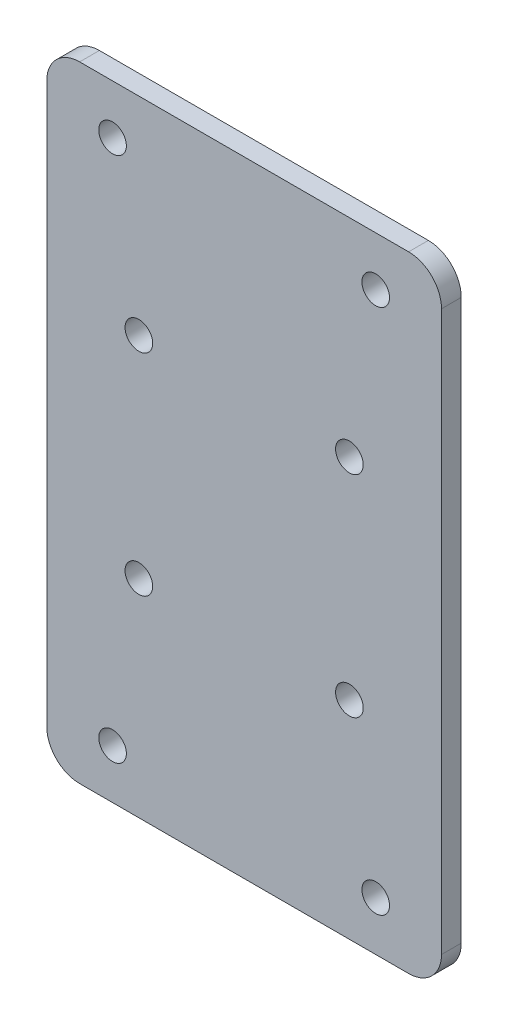
ISO-10303-21;
HEADER;
FILE_DESCRIPTION(('STEP AP214'),'2;1');
FILE_NAME('part.step','',(''),(''),'','','');
FILE_SCHEMA(('AUTOMOTIVE_DESIGN { 1 0 10303 214 1 1 1 1 }'));
ENDSEC;
DATA;
#1=APPLICATION_CONTEXT('core data for automotive mechanical design processes');
#2=APPLICATION_PROTOCOL_DEFINITION('international standard','automotive_design',2000,#1);
#3=PRODUCT_CONTEXT('',#1,'mechanical');
#4=PRODUCT('Part','Part','',(#3));
#5=PRODUCT_RELATED_PRODUCT_CATEGORY('part','',(#4));
#6=PRODUCT_DEFINITION_FORMATION('','',#4);
#7=PRODUCT_DEFINITION_CONTEXT('part definition',#1,'design');
#8=PRODUCT_DEFINITION('design','',#6,#7);
#9=PRODUCT_DEFINITION_SHAPE('','',#8);
#10=(LENGTH_UNIT() NAMED_UNIT(*) SI_UNIT(.MILLI.,.METRE.));
#11=(NAMED_UNIT(*) PLANE_ANGLE_UNIT() SI_UNIT($,.RADIAN.));
#12=(NAMED_UNIT(*) SI_UNIT($,.STERADIAN.) SOLID_ANGLE_UNIT());
#13=UNCERTAINTY_MEASURE_WITH_UNIT(LENGTH_MEASURE(1.E-05),#10,'distance_accuracy_value','');
#14=(GEOMETRIC_REPRESENTATION_CONTEXT(3) GLOBAL_UNCERTAINTY_ASSIGNED_CONTEXT((#13)) GLOBAL_UNIT_ASSIGNED_CONTEXT((#10,
#11,#12)) REPRESENTATION_CONTEXT('',''));
#15=CARTESIAN_POINT('',(0.,0.,0.));
#16=DIRECTION('',(0.,0.,1.));
#17=DIRECTION('',(1.,0.,0.));
#18=AXIS2_PLACEMENT_3D('',#15,#16,#17);
#19=CARTESIAN_POINT('',(0.,0.,3.));
#20=DIRECTION('',(0.,0.,1.));
#21=DIRECTION('',(1.,0.,0.));
#22=AXIS2_PLACEMENT_3D('',#19,#20,#21);
#23=PLANE('',#22);
#24=CARTESIAN_POINT('',(20.,40.,3.));
#25=DIRECTION('',(0.,0.,1.));
#26=DIRECTION('',(1.,0.,0.));
#27=AXIS2_PLACEMENT_3D('',#24,#25,#26);
#28=CIRCLE('',#27,2.1);
#29=CARTESIAN_POINT('',(22.1,40.,3.));
#30=VERTEX_POINT('',#29);
#31=EDGE_CURVE('E248',#30,#30,#28,.T.);
#32=ORIENTED_EDGE('',*,*,#31,.F.);
#33=EDGE_LOOP('',(#32));
#34=FACE_BOUND('',#33,.T.);
#35=CARTESIAN_POINT('',(-20.,40.,3.));
#36=DIRECTION('',(0.,0.,1.));
#37=DIRECTION('',(1.,0.,0.));
#38=AXIS2_PLACEMENT_3D('',#35,#36,#37);
#39=CIRCLE('',#38,2.1);
#40=CARTESIAN_POINT('',(-17.9,40.,3.));
#41=VERTEX_POINT('',#40);
#42=EDGE_CURVE('E232',#41,#41,#39,.T.);
#43=ORIENTED_EDGE('',*,*,#42,.F.);
#44=EDGE_LOOP('',(#43));
#45=FACE_BOUND('',#44,.T.);
#46=CARTESIAN_POINT('',(-16.,-16.,3.));
#47=DIRECTION('',(0.,0.,1.));
#48=DIRECTION('',(1.,0.,0.));
#49=AXIS2_PLACEMENT_3D('',#46,#47,#48);
#50=CIRCLE('',#49,2.1);
#51=CARTESIAN_POINT('',(-13.9,-16.,3.));
#52=VERTEX_POINT('',#51);
#53=EDGE_CURVE('E216',#52,#52,#50,.T.);
#54=ORIENTED_EDGE('',*,*,#53,.F.);
#55=EDGE_LOOP('',(#54));
#56=FACE_BOUND('',#55,.T.);
#57=CARTESIAN_POINT('',(-16.,16.,3.));
#58=DIRECTION('',(0.,0.,1.));
#59=DIRECTION('',(1.,0.,0.));
#60=AXIS2_PLACEMENT_3D('',#57,#58,#59);
#61=CIRCLE('',#60,2.1);
#62=CARTESIAN_POINT('',(-13.9,16.,3.));
#63=VERTEX_POINT('',#62);
#64=EDGE_CURVE('E193',#63,#63,#61,.T.);
#65=ORIENTED_EDGE('',*,*,#64,.F.);
#66=EDGE_LOOP('',(#65));
#67=FACE_BOUND('',#66,.T.);
#68=DIRECTION('',(0.,-1.,0.));
#69=VECTOR('',#68,1.);
#70=CARTESIAN_POINT('',(-30.,47.5,3.));
#71=LINE('',#70,#69);
#72=CARTESIAN_POINT('',(-30.,42.5,3.));
#73=VERTEX_POINT('',#72);
#74=CARTESIAN_POINT('',(-30.,-42.5,3.));
#75=VERTEX_POINT('',#74);
#76=EDGE_CURVE('E198',#73,#75,#71,.T.);
#77=ORIENTED_EDGE('',*,*,#76,.T.);
#78=CARTESIAN_POINT('',(-25.,-42.5,3.));
#79=DIRECTION('',(0.,0.,1.));
#80=DIRECTION('',(1.,0.,0.));
#81=AXIS2_PLACEMENT_3D('',#78,#79,#80);
#82=CIRCLE('',#81,5.);
#83=CARTESIAN_POINT('',(-25.,-47.5,3.));
#84=VERTEX_POINT('',#83);
#85=EDGE_CURVE('E174',#75,#84,#82,.T.);
#86=ORIENTED_EDGE('',*,*,#85,.T.);
#87=DIRECTION('',(1.,0.,0.));
#88=VECTOR('',#87,1.);
#89=CARTESIAN_POINT('',(-30.,-47.5,3.));
#90=LINE('',#89,#88);
#91=CARTESIAN_POINT('',(25.,-47.5,3.));
#92=VERTEX_POINT('',#91);
#93=EDGE_CURVE('E132',#84,#92,#90,.T.);
#94=ORIENTED_EDGE('',*,*,#93,.T.);
#95=CARTESIAN_POINT('',(25.,-42.5,3.));
#96=DIRECTION('',(0.,0.,1.));
#97=DIRECTION('',(1.,0.,0.));
#98=AXIS2_PLACEMENT_3D('',#95,#96,#97);
#99=CIRCLE('',#98,5.);
#100=CARTESIAN_POINT('',(30.,-42.5,3.));
#101=VERTEX_POINT('',#100);
#102=EDGE_CURVE('E171',#92,#101,#99,.T.);
#103=ORIENTED_EDGE('',*,*,#102,.T.);
#104=DIRECTION('',(0.,1.,0.));
#105=VECTOR('',#104,1.);
#106=CARTESIAN_POINT('',(30.,47.5,3.));
#107=LINE('',#106,#105);
#108=CARTESIAN_POINT('',(30.,42.5,3.));
#109=VERTEX_POINT('',#108);
#110=EDGE_CURVE('E141',#101,#109,#107,.T.);
#111=ORIENTED_EDGE('',*,*,#110,.T.);
#112=CARTESIAN_POINT('',(25.,42.5,3.));
#113=DIRECTION('',(0.,0.,1.));
#114=DIRECTION('',(1.,0.,0.));
#115=AXIS2_PLACEMENT_3D('',#112,#113,#114);
#116=CIRCLE('',#115,5.);
#117=CARTESIAN_POINT('',(25.,47.5,3.));
#118=VERTEX_POINT('',#117);
#119=EDGE_CURVE('E66',#109,#118,#116,.T.);
#120=ORIENTED_EDGE('',*,*,#119,.T.);
#121=DIRECTION('',(-1.,0.,0.));
#122=VECTOR('',#121,1.);
#123=CARTESIAN_POINT('',(-30.,47.5,3.));
#124=LINE('',#123,#122);
#125=CARTESIAN_POINT('',(-25.,47.5,3.));
#126=VERTEX_POINT('',#125);
#127=EDGE_CURVE('E146',#118,#126,#124,.T.);
#128=ORIENTED_EDGE('',*,*,#127,.T.);
#129=CARTESIAN_POINT('',(-25.,42.5,3.));
#130=DIRECTION('',(0.,0.,1.));
#131=DIRECTION('',(1.,0.,0.));
#132=AXIS2_PLACEMENT_3D('',#129,#130,#131);
#133=CIRCLE('',#132,5.);
#134=EDGE_CURVE('E168',#126,#73,#133,.T.);
#135=ORIENTED_EDGE('',*,*,#134,.T.);
#136=EDGE_LOOP('',(#77,#86,#94,#103,#111,#120,#128,#135));
#137=FACE_BOUND('',#136,.T.);
#138=CARTESIAN_POINT('',(16.,16.,3.));
#139=DIRECTION('',(0.,0.,1.));
#140=DIRECTION('',(1.,0.,0.));
#141=AXIS2_PLACEMENT_3D('',#138,#139,#140);
#142=CIRCLE('',#141,2.1);
#143=CARTESIAN_POINT('',(18.1,16.,3.));
#144=VERTEX_POINT('',#143);
#145=EDGE_CURVE('E208',#144,#144,#142,.T.);
#146=ORIENTED_EDGE('',*,*,#145,.F.);
#147=EDGE_LOOP('',(#146));
#148=FACE_BOUND('',#147,.T.);
#149=CARTESIAN_POINT('',(16.,-16.,3.));
#150=DIRECTION('',(0.,0.,1.));
#151=DIRECTION('',(1.,0.,0.));
#152=AXIS2_PLACEMENT_3D('',#149,#150,#151);
#153=CIRCLE('',#152,2.1);
#154=CARTESIAN_POINT('',(18.1,-16.,3.));
#155=VERTEX_POINT('',#154);
#156=EDGE_CURVE('E224',#155,#155,#153,.T.);
#157=ORIENTED_EDGE('',*,*,#156,.F.);
#158=EDGE_LOOP('',(#157));
#159=FACE_BOUND('',#158,.T.);
#160=CARTESIAN_POINT('',(-20.,-40.,3.));
#161=DIRECTION('',(0.,0.,1.));
#162=DIRECTION('',(1.,0.,0.));
#163=AXIS2_PLACEMENT_3D('',#160,#161,#162);
#164=CIRCLE('',#163,2.1);
#165=CARTESIAN_POINT('',(-17.9,-40.,3.));
#166=VERTEX_POINT('',#165);
#167=EDGE_CURVE('E240',#166,#166,#164,.T.);
#168=ORIENTED_EDGE('',*,*,#167,.F.);
#169=EDGE_LOOP('',(#168));
#170=FACE_BOUND('',#169,.T.);
#171=CARTESIAN_POINT('',(20.,-40.,3.));
#172=DIRECTION('',(0.,0.,1.));
#173=DIRECTION('',(1.,0.,0.));
#174=AXIS2_PLACEMENT_3D('',#171,#172,#173);
#175=CIRCLE('',#174,2.1);
#176=CARTESIAN_POINT('',(22.1,-40.,3.));
#177=VERTEX_POINT('',#176);
#178=EDGE_CURVE('E256',#177,#177,#175,.T.);
#179=ORIENTED_EDGE('',*,*,#178,.F.);
#180=EDGE_LOOP('',(#179));
#181=FACE_BOUND('',#180,.T.);
#182=ADVANCED_FACE('F45',(#34,#45,#56,#67,#137,#148,#159,#170,#181),#23,.T.);
#183=CARTESIAN_POINT('',(0.,0.,0.));
#184=DIRECTION('',(0.,0.,1.));
#185=DIRECTION('',(1.,0.,0.));
#186=AXIS2_PLACEMENT_3D('',#183,#184,#185);
#187=PLANE('',#186);
#188=DIRECTION('',(1.,0.,0.));
#189=VECTOR('',#188,1.);
#190=CARTESIAN_POINT('',(-30.,-47.5,0.));
#191=LINE('',#190,#189);
#192=CARTESIAN_POINT('',(-25.,-47.5,0.));
#193=VERTEX_POINT('',#192);
#194=CARTESIAN_POINT('',(25.,-47.5,0.));
#195=VERTEX_POINT('',#194);
#196=EDGE_CURVE('E129',#193,#195,#191,.T.);
#197=ORIENTED_EDGE('',*,*,#196,.F.);
#198=CARTESIAN_POINT('',(-25.,-42.5,0.));
#199=DIRECTION('',(0.,0.,1.));
#200=DIRECTION('',(1.,0.,0.));
#201=AXIS2_PLACEMENT_3D('',#198,#199,#200);
#202=CIRCLE('',#201,5.);
#203=CARTESIAN_POINT('',(-30.,-42.5,0.));
#204=VERTEX_POINT('',#203);
#205=EDGE_CURVE('E111',#193,#204,#202,.F.);
#206=ORIENTED_EDGE('',*,*,#205,.T.);
#207=DIRECTION('',(0.,-1.,0.));
#208=VECTOR('',#207,1.);
#209=CARTESIAN_POINT('',(-30.,47.5,0.));
#210=LINE('',#209,#208);
#211=CARTESIAN_POINT('',(-30.,42.5,0.));
#212=VERTEX_POINT('',#211);
#213=EDGE_CURVE('E142',#212,#204,#210,.T.);
#214=ORIENTED_EDGE('',*,*,#213,.F.);
#215=CARTESIAN_POINT('',(-25.,42.5,0.));
#216=DIRECTION('',(0.,0.,1.));
#217=DIRECTION('',(1.,0.,0.));
#218=AXIS2_PLACEMENT_3D('',#215,#216,#217);
#219=CIRCLE('',#218,5.);
#220=CARTESIAN_POINT('',(-25.,47.5,0.));
#221=VERTEX_POINT('',#220);
#222=EDGE_CURVE('E156',#212,#221,#219,.F.);
#223=ORIENTED_EDGE('',*,*,#222,.T.);
#224=DIRECTION('',(-1.,0.,0.));
#225=VECTOR('',#224,1.);
#226=CARTESIAN_POINT('',(-30.,47.5,0.));
#227=LINE('',#226,#225);
#228=CARTESIAN_POINT('',(25.,47.5,0.));
#229=VERTEX_POINT('',#228);
#230=EDGE_CURVE('E148',#229,#221,#227,.T.);
#231=ORIENTED_EDGE('',*,*,#230,.F.);
#232=CARTESIAN_POINT('',(25.,42.5,0.));
#233=DIRECTION('',(0.,0.,1.));
#234=DIRECTION('',(1.,0.,0.));
#235=AXIS2_PLACEMENT_3D('',#232,#233,#234);
#236=CIRCLE('',#235,5.);
#237=CARTESIAN_POINT('',(30.,42.5,0.));
#238=VERTEX_POINT('',#237);
#239=EDGE_CURVE('E134',#229,#238,#236,.F.);
#240=ORIENTED_EDGE('',*,*,#239,.T.);
#241=DIRECTION('',(0.,1.,0.));
#242=VECTOR('',#241,1.);
#243=CARTESIAN_POINT('',(30.,47.5,0.));
#244=LINE('',#243,#242);
#245=CARTESIAN_POINT('',(30.,-42.5,0.));
#246=VERTEX_POINT('',#245);
#247=EDGE_CURVE('E191',#246,#238,#244,.T.);
#248=ORIENTED_EDGE('',*,*,#247,.F.);
#249=CARTESIAN_POINT('',(25.,-42.5,0.));
#250=DIRECTION('',(0.,0.,1.));
#251=DIRECTION('',(1.,0.,0.));
#252=AXIS2_PLACEMENT_3D('',#249,#250,#251);
#253=CIRCLE('',#252,5.);
#254=EDGE_CURVE('E123',#246,#195,#253,.F.);
#255=ORIENTED_EDGE('',*,*,#254,.T.);
#256=EDGE_LOOP('',(#197,#206,#214,#223,#231,#240,#248,#255));
#257=FACE_BOUND('',#256,.T.);
#258=CARTESIAN_POINT('',(-16.,16.,0.));
#259=DIRECTION('',(0.,0.,1.));
#260=DIRECTION('',(1.,0.,0.));
#261=AXIS2_PLACEMENT_3D('',#258,#259,#260);
#262=CIRCLE('',#261,2.1);
#263=CARTESIAN_POINT('',(-13.9,16.,0.));
#264=VERTEX_POINT('',#263);
#265=EDGE_CURVE('E204',#264,#264,#262,.T.);
#266=ORIENTED_EDGE('',*,*,#265,.T.);
#267=EDGE_LOOP('',(#266));
#268=FACE_BOUND('',#267,.T.);
#269=CARTESIAN_POINT('',(16.,16.,0.));
#270=DIRECTION('',(0.,0.,1.));
#271=DIRECTION('',(1.,0.,0.));
#272=AXIS2_PLACEMENT_3D('',#269,#270,#271);
#273=CIRCLE('',#272,2.1);
#274=CARTESIAN_POINT('',(18.1,16.,0.));
#275=VERTEX_POINT('',#274);
#276=EDGE_CURVE('E212',#275,#275,#273,.T.);
#277=ORIENTED_EDGE('',*,*,#276,.T.);
#278=EDGE_LOOP('',(#277));
#279=FACE_BOUND('',#278,.T.);
#280=CARTESIAN_POINT('',(-16.,-16.,0.));
#281=DIRECTION('',(0.,0.,1.));
#282=DIRECTION('',(1.,0.,0.));
#283=AXIS2_PLACEMENT_3D('',#280,#281,#282);
#284=CIRCLE('',#283,2.1);
#285=CARTESIAN_POINT('',(-13.9,-16.,0.));
#286=VERTEX_POINT('',#285);
#287=EDGE_CURVE('E220',#286,#286,#284,.T.);
#288=ORIENTED_EDGE('',*,*,#287,.T.);
#289=EDGE_LOOP('',(#288));
#290=FACE_BOUND('',#289,.T.);
#291=CARTESIAN_POINT('',(16.,-16.,0.));
#292=DIRECTION('',(0.,0.,1.));
#293=DIRECTION('',(1.,0.,0.));
#294=AXIS2_PLACEMENT_3D('',#291,#292,#293);
#295=CIRCLE('',#294,2.1);
#296=CARTESIAN_POINT('',(18.1,-16.,0.));
#297=VERTEX_POINT('',#296);
#298=EDGE_CURVE('E228',#297,#297,#295,.T.);
#299=ORIENTED_EDGE('',*,*,#298,.T.);
#300=EDGE_LOOP('',(#299));
#301=FACE_BOUND('',#300,.T.);
#302=CARTESIAN_POINT('',(-20.,40.,0.));
#303=DIRECTION('',(0.,0.,1.));
#304=DIRECTION('',(1.,0.,0.));
#305=AXIS2_PLACEMENT_3D('',#302,#303,#304);
#306=CIRCLE('',#305,2.1);
#307=CARTESIAN_POINT('',(-17.9,40.,0.));
#308=VERTEX_POINT('',#307);
#309=EDGE_CURVE('E236',#308,#308,#306,.T.);
#310=ORIENTED_EDGE('',*,*,#309,.T.);
#311=EDGE_LOOP('',(#310));
#312=FACE_BOUND('',#311,.T.);
#313=CARTESIAN_POINT('',(-20.,-40.,0.));
#314=DIRECTION('',(0.,0.,1.));
#315=DIRECTION('',(1.,0.,0.));
#316=AXIS2_PLACEMENT_3D('',#313,#314,#315);
#317=CIRCLE('',#316,2.1);
#318=CARTESIAN_POINT('',(-17.9,-40.,0.));
#319=VERTEX_POINT('',#318);
#320=EDGE_CURVE('E244',#319,#319,#317,.T.);
#321=ORIENTED_EDGE('',*,*,#320,.T.);
#322=EDGE_LOOP('',(#321));
#323=FACE_BOUND('',#322,.T.);
#324=CARTESIAN_POINT('',(20.,40.,0.));
#325=DIRECTION('',(0.,0.,1.));
#326=DIRECTION('',(1.,0.,0.));
#327=AXIS2_PLACEMENT_3D('',#324,#325,#326);
#328=CIRCLE('',#327,2.1);
#329=CARTESIAN_POINT('',(22.1,40.,0.));
#330=VERTEX_POINT('',#329);
#331=EDGE_CURVE('E252',#330,#330,#328,.T.);
#332=ORIENTED_EDGE('',*,*,#331,.T.);
#333=EDGE_LOOP('',(#332));
#334=FACE_BOUND('',#333,.T.);
#335=CARTESIAN_POINT('',(20.,-40.,0.));
#336=DIRECTION('',(0.,0.,1.));
#337=DIRECTION('',(1.,0.,0.));
#338=AXIS2_PLACEMENT_3D('',#335,#336,#337);
#339=CIRCLE('',#338,2.1);
#340=CARTESIAN_POINT('',(22.1,-40.,0.));
#341=VERTEX_POINT('',#340);
#342=EDGE_CURVE('E260',#341,#341,#339,.T.);
#343=ORIENTED_EDGE('',*,*,#342,.T.);
#344=EDGE_LOOP('',(#343));
#345=FACE_BOUND('',#344,.T.);
#346=ADVANCED_FACE('F137',(#257,#268,#279,#290,#301,#312,#323,#334,#345),#187,.F.);
#347=CARTESIAN_POINT('',(30.,47.5,3.));
#348=DIRECTION('',(-1.,0.,0.));
#349=DIRECTION('',(0.,0.,1.));
#350=AXIS2_PLACEMENT_3D('',#347,#348,#349);
#351=PLANE('',#350);
#352=ORIENTED_EDGE('',*,*,#110,.F.);
#353=DIRECTION('',(0.,0.,-1.));
#354=VECTOR('',#353,1.);
#355=CARTESIAN_POINT('',(30.,-42.5,3.));
#356=LINE('',#355,#354);
#357=EDGE_CURVE('E180',#101,#246,#356,.T.);
#358=ORIENTED_EDGE('',*,*,#357,.T.);
#359=ORIENTED_EDGE('',*,*,#247,.T.);
#360=DIRECTION('',(0.,0.,-1.));
#361=VECTOR('',#360,1.);
#362=CARTESIAN_POINT('',(30.,42.5,3.));
#363=LINE('',#362,#361);
#364=EDGE_CURVE('E177',#238,#109,#363,.F.);
#365=ORIENTED_EDGE('',*,*,#364,.T.);
#366=EDGE_LOOP('',(#352,#358,#359,#365));
#367=FACE_BOUND('',#366,.T.);
#368=ADVANCED_FACE('F278',(#367),#351,.F.);
#369=CARTESIAN_POINT('',(-30.,47.5,3.));
#370=DIRECTION('',(0.,-1.,0.));
#371=DIRECTION('',(0.,0.,-1.));
#372=AXIS2_PLACEMENT_3D('',#369,#370,#371);
#373=PLANE('',#372);
#374=ORIENTED_EDGE('',*,*,#230,.T.);
#375=DIRECTION('',(0.,0.,-1.));
#376=VECTOR('',#375,1.);
#377=CARTESIAN_POINT('',(-25.,47.5,3.));
#378=LINE('',#377,#376);
#379=EDGE_CURVE('E11',#221,#126,#378,.F.);
#380=ORIENTED_EDGE('',*,*,#379,.T.);
#381=ORIENTED_EDGE('',*,*,#127,.F.);
#382=DIRECTION('',(0.,0.,-1.));
#383=VECTOR('',#382,1.);
#384=CARTESIAN_POINT('',(25.,47.5,3.));
#385=LINE('',#384,#383);
#386=EDGE_CURVE('E54',#118,#229,#385,.T.);
#387=ORIENTED_EDGE('',*,*,#386,.T.);
#388=EDGE_LOOP('',(#374,#380,#381,#387));
#389=FACE_BOUND('',#388,.T.);
#390=ADVANCED_FACE('F187',(#389),#373,.F.);
#391=CARTESIAN_POINT('',(-30.,47.5,3.));
#392=DIRECTION('',(1.,0.,0.));
#393=DIRECTION('',(0.,0.,-1.));
#394=AXIS2_PLACEMENT_3D('',#391,#392,#393);
#395=PLANE('',#394);
#396=ORIENTED_EDGE('',*,*,#213,.T.);
#397=DIRECTION('',(0.,0.,-1.));
#398=VECTOR('',#397,1.);
#399=CARTESIAN_POINT('',(-30.,-42.5,3.));
#400=LINE('',#399,#398);
#401=EDGE_CURVE('E116',#204,#75,#400,.F.);
#402=ORIENTED_EDGE('',*,*,#401,.T.);
#403=ORIENTED_EDGE('',*,*,#76,.F.);
#404=DIRECTION('',(0.,0.,-1.));
#405=VECTOR('',#404,1.);
#406=CARTESIAN_POINT('',(-30.,42.5,3.));
#407=LINE('',#406,#405);
#408=EDGE_CURVE('E122',#73,#212,#407,.T.);
#409=ORIENTED_EDGE('',*,*,#408,.T.);
#410=EDGE_LOOP('',(#396,#402,#403,#409));
#411=FACE_BOUND('',#410,.T.);
#412=ADVANCED_FACE('F288',(#411),#395,.F.);
#413=CARTESIAN_POINT('',(-30.,-47.5,3.));
#414=DIRECTION('',(0.,1.,0.));
#415=DIRECTION('',(0.,0.,1.));
#416=AXIS2_PLACEMENT_3D('',#413,#414,#415);
#417=PLANE('',#416);
#418=ORIENTED_EDGE('',*,*,#93,.F.);
#419=DIRECTION('',(0.,0.,-1.));
#420=VECTOR('',#419,1.);
#421=CARTESIAN_POINT('',(-25.,-47.5,3.));
#422=LINE('',#421,#420);
#423=EDGE_CURVE('E115',#84,#193,#422,.T.);
#424=ORIENTED_EDGE('',*,*,#423,.T.);
#425=ORIENTED_EDGE('',*,*,#196,.T.);
#426=DIRECTION('',(0.,0.,-1.));
#427=VECTOR('',#426,1.);
#428=CARTESIAN_POINT('',(25.,-47.5,3.));
#429=LINE('',#428,#427);
#430=EDGE_CURVE('E135',#195,#92,#429,.F.);
#431=ORIENTED_EDGE('',*,*,#430,.T.);
#432=EDGE_LOOP('',(#418,#424,#425,#431));
#433=FACE_BOUND('',#432,.T.);
#434=ADVANCED_FACE('F128',(#433),#417,.F.);
#435=CARTESIAN_POINT('',(-16.,16.,3.));
#436=DIRECTION('',(0.,0.,-1.));
#437=DIRECTION('',(-1.,0.,0.));
#438=AXIS2_PLACEMENT_3D('',#435,#436,#437);
#439=CYLINDRICAL_SURFACE('',#438,2.1);
#440=ORIENTED_EDGE('',*,*,#64,.T.);
#441=EDGE_LOOP('',(#440));
#442=FACE_BOUND('',#441,.T.);
#443=ORIENTED_EDGE('',*,*,#265,.F.);
#444=EDGE_LOOP('',(#443));
#445=FACE_BOUND('',#444,.T.);
#446=ADVANCED_FACE('F283',(#442,#445),#439,.F.);
#447=CARTESIAN_POINT('',(16.,16.,3.));
#448=DIRECTION('',(0.,0.,-1.));
#449=DIRECTION('',(-1.,0.,0.));
#450=AXIS2_PLACEMENT_3D('',#447,#448,#449);
#451=CYLINDRICAL_SURFACE('',#450,2.1);
#452=ORIENTED_EDGE('',*,*,#145,.T.);
#453=EDGE_LOOP('',(#452));
#454=FACE_BOUND('',#453,.T.);
#455=ORIENTED_EDGE('',*,*,#276,.F.);
#456=EDGE_LOOP('',(#455));
#457=FACE_BOUND('',#456,.T.);
#458=ADVANCED_FACE('F350',(#454,#457),#451,.F.);
#459=CARTESIAN_POINT('',(-16.,-16.,3.));
#460=DIRECTION('',(0.,0.,-1.));
#461=DIRECTION('',(-1.,0.,0.));
#462=AXIS2_PLACEMENT_3D('',#459,#460,#461);
#463=CYLINDRICAL_SURFACE('',#462,2.1);
#464=ORIENTED_EDGE('',*,*,#53,.T.);
#465=EDGE_LOOP('',(#464));
#466=FACE_BOUND('',#465,.T.);
#467=ORIENTED_EDGE('',*,*,#287,.F.);
#468=EDGE_LOOP('',(#467));
#469=FACE_BOUND('',#468,.T.);
#470=ADVANCED_FACE('F347',(#466,#469),#463,.F.);
#471=CARTESIAN_POINT('',(16.,-16.,3.));
#472=DIRECTION('',(0.,0.,-1.));
#473=DIRECTION('',(-1.,0.,0.));
#474=AXIS2_PLACEMENT_3D('',#471,#472,#473);
#475=CYLINDRICAL_SURFACE('',#474,2.1);
#476=ORIENTED_EDGE('',*,*,#156,.T.);
#477=EDGE_LOOP('',(#476));
#478=FACE_BOUND('',#477,.T.);
#479=ORIENTED_EDGE('',*,*,#298,.F.);
#480=EDGE_LOOP('',(#479));
#481=FACE_BOUND('',#480,.T.);
#482=ADVANCED_FACE('F343',(#478,#481),#475,.F.);
#483=CARTESIAN_POINT('',(-20.,40.,3.));
#484=DIRECTION('',(0.,0.,-1.));
#485=DIRECTION('',(-1.,0.,0.));
#486=AXIS2_PLACEMENT_3D('',#483,#484,#485);
#487=CYLINDRICAL_SURFACE('',#486,2.1);
#488=ORIENTED_EDGE('',*,*,#42,.T.);
#489=EDGE_LOOP('',(#488));
#490=FACE_BOUND('',#489,.T.);
#491=ORIENTED_EDGE('',*,*,#309,.F.);
#492=EDGE_LOOP('',(#491));
#493=FACE_BOUND('',#492,.T.);
#494=ADVANCED_FACE('F326',(#490,#493),#487,.F.);
#495=CARTESIAN_POINT('',(-20.,-40.,3.));
#496=DIRECTION('',(0.,0.,-1.));
#497=DIRECTION('',(-1.,0.,0.));
#498=AXIS2_PLACEMENT_3D('',#495,#496,#497);
#499=CYLINDRICAL_SURFACE('',#498,2.1);
#500=ORIENTED_EDGE('',*,*,#167,.T.);
#501=EDGE_LOOP('',(#500));
#502=FACE_BOUND('',#501,.T.);
#503=ORIENTED_EDGE('',*,*,#320,.F.);
#504=EDGE_LOOP('',(#503));
#505=FACE_BOUND('',#504,.T.);
#506=ADVANCED_FACE('F322',(#502,#505),#499,.F.);
#507=CARTESIAN_POINT('',(20.,40.,3.));
#508=DIRECTION('',(0.,0.,-1.));
#509=DIRECTION('',(-1.,0.,0.));
#510=AXIS2_PLACEMENT_3D('',#507,#508,#509);
#511=CYLINDRICAL_SURFACE('',#510,2.1);
#512=ORIENTED_EDGE('',*,*,#31,.T.);
#513=EDGE_LOOP('',(#512));
#514=FACE_BOUND('',#513,.T.);
#515=ORIENTED_EDGE('',*,*,#331,.F.);
#516=EDGE_LOOP('',(#515));
#517=FACE_BOUND('',#516,.T.);
#518=ADVANCED_FACE('F325',(#514,#517),#511,.F.);
#519=CARTESIAN_POINT('',(20.,-40.,3.));
#520=DIRECTION('',(0.,0.,-1.));
#521=DIRECTION('',(-1.,0.,0.));
#522=AXIS2_PLACEMENT_3D('',#519,#520,#521);
#523=CYLINDRICAL_SURFACE('',#522,2.1);
#524=ORIENTED_EDGE('',*,*,#178,.T.);
#525=EDGE_LOOP('',(#524));
#526=FACE_BOUND('',#525,.T.);
#527=ORIENTED_EDGE('',*,*,#342,.F.);
#528=EDGE_LOOP('',(#527));
#529=FACE_BOUND('',#528,.T.);
#530=ADVANCED_FACE('F268',(#526,#529),#523,.F.);
#531=CARTESIAN_POINT('',(-25.,-42.5,3.));
#532=DIRECTION('',(0.,0.,-1.));
#533=DIRECTION('',(-1.,0.,0.));
#534=AXIS2_PLACEMENT_3D('',#531,#532,#533);
#535=CYLINDRICAL_SURFACE('',#534,5.);
#536=ORIENTED_EDGE('',*,*,#85,.F.);
#537=ORIENTED_EDGE('',*,*,#401,.F.);
#538=ORIENTED_EDGE('',*,*,#205,.F.);
#539=ORIENTED_EDGE('',*,*,#423,.F.);
#540=EDGE_LOOP('',(#536,#537,#538,#539));
#541=FACE_BOUND('',#540,.T.);
#542=ADVANCED_FACE('F114',(#541),#535,.T.);
#543=CARTESIAN_POINT('',(25.,-42.5,3.));
#544=DIRECTION('',(0.,0.,-1.));
#545=DIRECTION('',(-1.,0.,0.));
#546=AXIS2_PLACEMENT_3D('',#543,#544,#545);
#547=CYLINDRICAL_SURFACE('',#546,5.);
#548=ORIENTED_EDGE('',*,*,#102,.F.);
#549=ORIENTED_EDGE('',*,*,#430,.F.);
#550=ORIENTED_EDGE('',*,*,#254,.F.);
#551=ORIENTED_EDGE('',*,*,#357,.F.);
#552=EDGE_LOOP('',(#548,#549,#550,#551));
#553=FACE_BOUND('',#552,.T.);
#554=ADVANCED_FACE('F299',(#553),#547,.T.);
#555=CARTESIAN_POINT('',(-25.,42.5,3.));
#556=DIRECTION('',(0.,0.,-1.));
#557=DIRECTION('',(-1.,0.,0.));
#558=AXIS2_PLACEMENT_3D('',#555,#556,#557);
#559=CYLINDRICAL_SURFACE('',#558,5.);
#560=ORIENTED_EDGE('',*,*,#134,.F.);
#561=ORIENTED_EDGE('',*,*,#379,.F.);
#562=ORIENTED_EDGE('',*,*,#222,.F.);
#563=ORIENTED_EDGE('',*,*,#408,.F.);
#564=EDGE_LOOP('',(#560,#561,#562,#563));
#565=FACE_BOUND('',#564,.T.);
#566=ADVANCED_FACE('F301',(#565),#559,.T.);
#567=CARTESIAN_POINT('',(25.,42.5,3.));
#568=DIRECTION('',(0.,0.,-1.));
#569=DIRECTION('',(-1.,0.,0.));
#570=AXIS2_PLACEMENT_3D('',#567,#568,#569);
#571=CYLINDRICAL_SURFACE('',#570,5.);
#572=ORIENTED_EDGE('',*,*,#119,.F.);
#573=ORIENTED_EDGE('',*,*,#364,.F.);
#574=ORIENTED_EDGE('',*,*,#239,.F.);
#575=ORIENTED_EDGE('',*,*,#386,.F.);
#576=EDGE_LOOP('',(#572,#573,#574,#575));
#577=FACE_BOUND('',#576,.T.);
#578=ADVANCED_FACE('F47',(#577),#571,.T.);
#579=CLOSED_SHELL('',(#182,#346,#368,#390,#412,#434,#446,#458,#470,#482,#494,#506,#518,#530,
#542,#554,#566,#578));
#580=MANIFOLD_SOLID_BREP('B2',#579);
#581=ADVANCED_BREP_SHAPE_REPRESENTATION('',(#18,#580),#14);
#582=SHAPE_DEFINITION_REPRESENTATION(#9,#581);
ENDSEC;
END-ISO-10303-21;
